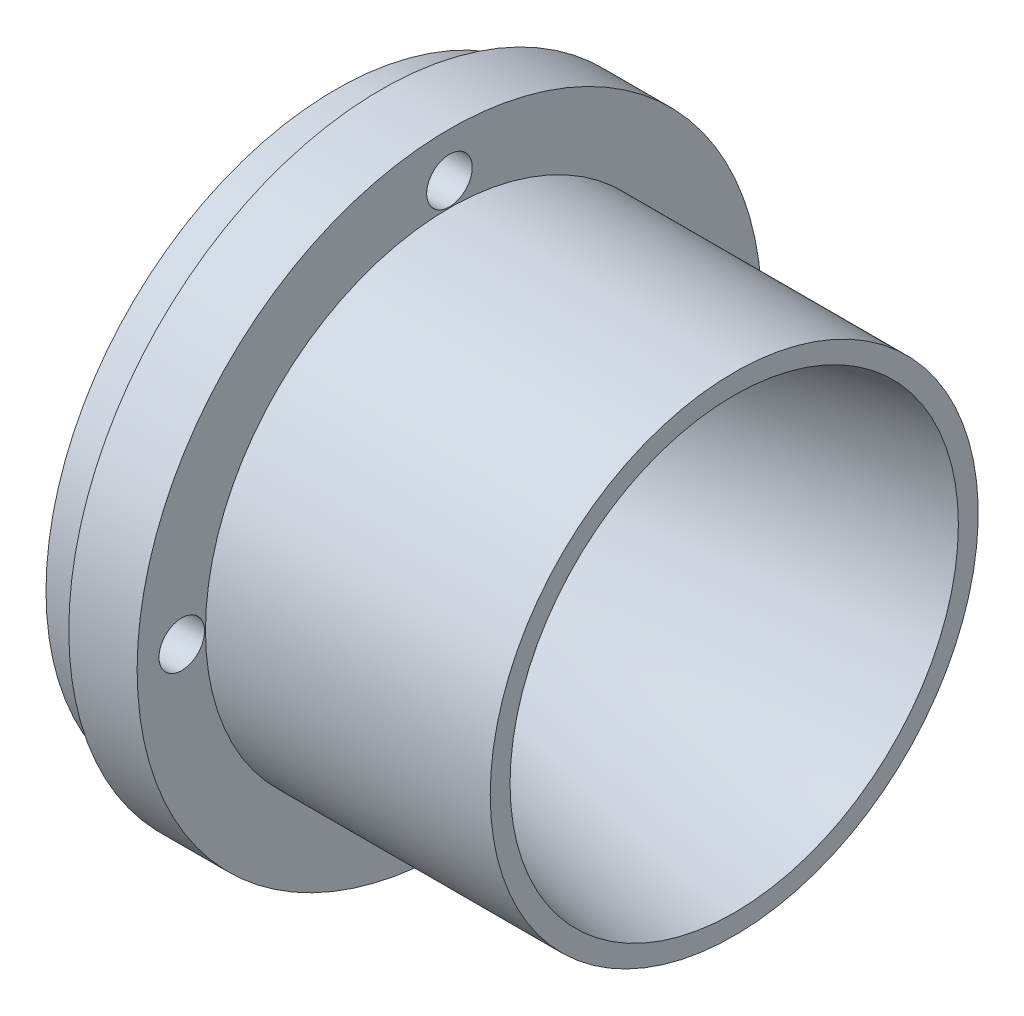
ISO-10303-21;
HEADER;
FILE_DESCRIPTION(('STEP AP214'),'2;1');
FILE_NAME('part.step','',(''),(''),'','','');
FILE_SCHEMA(('AUTOMOTIVE_DESIGN { 1 0 10303 214 1 1 1 1 }'));
ENDSEC;
DATA;
#1=APPLICATION_CONTEXT('core data for automotive mechanical design processes');
#2=APPLICATION_PROTOCOL_DEFINITION('international standard','automotive_design',2000,#1);
#3=PRODUCT_CONTEXT('',#1,'mechanical');
#4=PRODUCT('Part','Part','',(#3));
#5=PRODUCT_RELATED_PRODUCT_CATEGORY('part','',(#4));
#6=PRODUCT_DEFINITION_FORMATION('','',#4);
#7=PRODUCT_DEFINITION_CONTEXT('part definition',#1,'design');
#8=PRODUCT_DEFINITION('design','',#6,#7);
#9=PRODUCT_DEFINITION_SHAPE('','',#8);
#10=(LENGTH_UNIT() NAMED_UNIT(*) SI_UNIT(.MILLI.,.METRE.));
#11=(NAMED_UNIT(*) PLANE_ANGLE_UNIT() SI_UNIT($,.RADIAN.));
#12=(NAMED_UNIT(*) SI_UNIT($,.STERADIAN.) SOLID_ANGLE_UNIT());
#13=UNCERTAINTY_MEASURE_WITH_UNIT(LENGTH_MEASURE(1.E-05),#10,'distance_accuracy_value','');
#14=(GEOMETRIC_REPRESENTATION_CONTEXT(3) GLOBAL_UNCERTAINTY_ASSIGNED_CONTEXT((#13)) GLOBAL_UNIT_ASSIGNED_CONTEXT((#10,
#11,#12)) REPRESENTATION_CONTEXT('',''));
#15=CARTESIAN_POINT('',(0.,0.,0.));
#16=DIRECTION('',(0.,0.,1.));
#17=DIRECTION('',(1.,0.,0.));
#18=AXIS2_PLACEMENT_3D('',#15,#16,#17);
#19=CARTESIAN_POINT('',(57.15,0.,0.));
#20=DIRECTION('',(-1.,0.,0.));
#21=DIRECTION('',(0.,0.,1.));
#22=AXIS2_PLACEMENT_3D('',#19,#20,#21);
#23=PLANE('',#22);
#24=CARTESIAN_POINT('',(57.15,0.,0.));
#25=DIRECTION('',(-1.,0.,0.));
#26=DIRECTION('',(0.,0.,1.));
#27=AXIS2_PLACEMENT_3D('',#24,#25,#26);
#28=CIRCLE('',#27,22.8854);
#29=CARTESIAN_POINT('',(57.15,0.,22.8854));
#30=VERTEX_POINT('',#29);
#31=EDGE_CURVE('E112',#30,#30,#28,.T.);
#32=ORIENTED_EDGE('',*,*,#31,.T.);
#33=EDGE_LOOP('',(#32));
#34=FACE_BOUND('',#33,.T.);
#35=CARTESIAN_POINT('',(57.15,0.,0.));
#36=DIRECTION('',(-1.,0.,0.));
#37=DIRECTION('',(0.,0.,1.));
#38=AXIS2_PLACEMENT_3D('',#35,#36,#37);
#39=CIRCLE('',#38,12.7390881433566);
#40=CARTESIAN_POINT('',(57.15,0.,12.7390881433566));
#41=VERTEX_POINT('',#40);
#42=EDGE_CURVE('E39',#41,#41,#39,.T.);
#43=ORIENTED_EDGE('',*,*,#42,.F.);
#44=EDGE_LOOP('',(#43));
#45=FACE_BOUND('',#44,.T.);
#46=ADVANCED_FACE('F35',(#34,#45),#23,.T.);
#47=CARTESIAN_POINT('',(-88.99,0.,0.));
#48=DIRECTION('',(-1.,0.,0.));
#49=DIRECTION('',(0.,0.,1.));
#50=AXIS2_PLACEMENT_3D('',#47,#48,#49);
#51=CYLINDRICAL_SURFACE('',#50,34.8234);
#52=CARTESIAN_POINT('',(69.85,0.,0.));
#53=DIRECTION('',(-1.,0.,0.));
#54=DIRECTION('',(0.,0.,1.));
#55=AXIS2_PLACEMENT_3D('',#52,#53,#54);
#56=CIRCLE('',#55,34.8234);
#57=CARTESIAN_POINT('',(69.85,0.,34.8234));
#58=VERTEX_POINT('',#57);
#59=EDGE_CURVE('E43',#58,#58,#56,.T.);
#60=ORIENTED_EDGE('',*,*,#59,.T.);
#61=EDGE_LOOP('',(#60));
#62=FACE_BOUND('',#61,.T.);
#63=CARTESIAN_POINT('',(62.23,0.,0.));
#64=DIRECTION('',(-1.,0.,0.));
#65=DIRECTION('',(0.,0.,1.));
#66=AXIS2_PLACEMENT_3D('',#63,#64,#65);
#67=CIRCLE('',#66,34.8234);
#68=CARTESIAN_POINT('',(62.23,0.,34.8234));
#69=VERTEX_POINT('',#68);
#70=EDGE_CURVE('E61',#69,#69,#67,.T.);
#71=ORIENTED_EDGE('',*,*,#70,.F.);
#72=EDGE_LOOP('',(#71));
#73=FACE_BOUND('',#72,.T.);
#74=ADVANCED_FACE('F155',(#62,#73),#51,.T.);
#75=CARTESIAN_POINT('',(131.36778252185,0.,0.));
#76=DIRECTION('',(-1.,0.,0.));
#77=DIRECTION('',(0.,0.,1.));
#78=AXIS2_PLACEMENT_3D('',#75,#76,#77);
#79=DEGENERATE_TOROIDAL_SURFACE('',#78,169.723720561331,196.979582197912,.F.);
#80=CARTESIAN_POINT('',(101.599999999996,0.,0.));
#81=DIRECTION('',(-1.,0.,0.));
#82=DIRECTION('',(0.,0.,1.));
#83=AXIS2_PLACEMENT_3D('',#80,#81,#82);
#84=CIRCLE('',#83,24.9936000000294);
#85=CARTESIAN_POINT('',(101.599999999996,0.,24.9936000000294));
#86=VERTEX_POINT('',#85);
#87=EDGE_CURVE('E10',#86,#86,#84,.T.);
#88=ORIENTED_EDGE('',*,*,#87,.F.);
#89=EDGE_LOOP('',(#88));
#90=FACE_BOUND('',#89,.T.);
#91=ORIENTED_EDGE('',*,*,#42,.T.);
#92=EDGE_LOOP('',(#91));
#93=FACE_BOUND('',#92,.T.);
#94=ADVANCED_FACE('F160',(#90,#93),#79,.T.);
#95=CARTESIAN_POINT('',(101.6,34.8234,0.));
#96=DIRECTION('',(-1.,0.,0.));
#97=DIRECTION('',(0.,0.,1.));
#98=AXIS2_PLACEMENT_3D('',#95,#96,#97);
#99=PLANE('',#98);
#100=ORIENTED_EDGE('',*,*,#87,.T.);
#101=EDGE_LOOP('',(#100));
#102=FACE_BOUND('',#101,.T.);
#103=CARTESIAN_POINT('',(101.6,0.,0.));
#104=DIRECTION('',(-1.,0.,0.));
#105=DIRECTION('',(0.,0.,1.));
#106=AXIS2_PLACEMENT_3D('',#103,#104,#105);
#107=CIRCLE('',#106,27.2034);
#108=CARTESIAN_POINT('',(101.6,0.,27.2034));
#109=VERTEX_POINT('',#108);
#110=EDGE_CURVE('E52',#109,#109,#107,.T.);
#111=ORIENTED_EDGE('',*,*,#110,.F.);
#112=EDGE_LOOP('',(#111));
#113=FACE_BOUND('',#112,.T.);
#114=ADVANCED_FACE('F37',(#102,#113),#99,.F.);
#115=CARTESIAN_POINT('',(69.85,27.2034,0.));
#116=DIRECTION('',(1.,0.,0.));
#117=DIRECTION('',(0.,0.,-1.));
#118=AXIS2_PLACEMENT_3D('',#115,#116,#117);
#119=PLANE('',#118);
#120=CARTESIAN_POINT('',(69.85,3.1260978167332E-13,-29.845));
#121=DIRECTION('',(1.,0.,0.));
#122=DIRECTION('',(0.,0.,-1.));
#123=AXIS2_PLACEMENT_3D('',#120,#121,#122);
#124=CIRCLE('',#123,2.54);
#125=CARTESIAN_POINT('',(69.85,3.1260978167332E-13,-32.385));
#126=VERTEX_POINT('',#125);
#127=EDGE_CURVE('E109',#126,#126,#124,.T.);
#128=ORIENTED_EDGE('',*,*,#127,.F.);
#129=EDGE_LOOP('',(#128));
#130=FACE_BOUND('',#129,.T.);
#131=CARTESIAN_POINT('',(69.85,-29.845,0.));
#132=DIRECTION('',(1.,0.,0.));
#133=DIRECTION('',(0.,0.,-1.));
#134=AXIS2_PLACEMENT_3D('',#131,#132,#133);
#135=CIRCLE('',#134,2.54);
#136=CARTESIAN_POINT('',(69.85,-29.845,-2.54));
#137=VERTEX_POINT('',#136);
#138=EDGE_CURVE('E97',#137,#137,#135,.T.);
#139=ORIENTED_EDGE('',*,*,#138,.F.);
#140=EDGE_LOOP('',(#139));
#141=FACE_BOUND('',#140,.T.);
#142=CARTESIAN_POINT('',(69.85,-1.04203260557773E-13,29.845));
#143=DIRECTION('',(1.,0.,0.));
#144=DIRECTION('',(0.,0.,-1.));
#145=AXIS2_PLACEMENT_3D('',#142,#143,#144);
#146=CIRCLE('',#145,2.54);
#147=CARTESIAN_POINT('',(69.85,-1.04203260557773E-13,27.305));
#148=VERTEX_POINT('',#147);
#149=EDGE_CURVE('E85',#148,#148,#146,.T.);
#150=ORIENTED_EDGE('',*,*,#149,.F.);
#151=EDGE_LOOP('',(#150));
#152=FACE_BOUND('',#151,.T.);
#153=CARTESIAN_POINT('',(69.85,29.845,0.));
#154=DIRECTION('',(1.,0.,0.));
#155=DIRECTION('',(0.,0.,-1.));
#156=AXIS2_PLACEMENT_3D('',#153,#154,#155);
#157=CIRCLE('',#156,2.54);
#158=CARTESIAN_POINT('',(69.85,29.845,-2.54));
#159=VERTEX_POINT('',#158);
#160=EDGE_CURVE('E73',#159,#159,#157,.T.);
#161=ORIENTED_EDGE('',*,*,#160,.F.);
#162=EDGE_LOOP('',(#161));
#163=FACE_BOUND('',#162,.T.);
#164=CARTESIAN_POINT('',(69.85,0.,0.));
#165=DIRECTION('',(-1.,0.,0.));
#166=DIRECTION('',(0.,0.,1.));
#167=AXIS2_PLACEMENT_3D('',#164,#165,#166);
#168=CIRCLE('',#167,27.2034);
#169=CARTESIAN_POINT('',(69.85,0.,27.2034));
#170=VERTEX_POINT('',#169);
#171=EDGE_CURVE('E47',#170,#170,#168,.T.);
#172=ORIENTED_EDGE('',*,*,#171,.T.);
#173=EDGE_LOOP('',(#172));
#174=FACE_BOUND('',#173,.T.);
#175=ORIENTED_EDGE('',*,*,#59,.F.);
#176=EDGE_LOOP('',(#175));
#177=FACE_BOUND('',#176,.T.);
#178=ADVANCED_FACE('F166',(#130,#141,#152,#163,#174,#177),#119,.T.);
#179=CARTESIAN_POINT('',(-14.4069937020437,0.,0.));
#180=DIRECTION('',(-1.,0.,0.));
#181=DIRECTION('',(0.,0.,1.));
#182=AXIS2_PLACEMENT_3D('',#179,#180,#181);
#183=CYLINDRICAL_SURFACE('',#182,27.2034);
#184=ORIENTED_EDGE('',*,*,#110,.T.);
#185=EDGE_LOOP('',(#184));
#186=FACE_BOUND('',#185,.T.);
#187=ORIENTED_EDGE('',*,*,#171,.F.);
#188=EDGE_LOOP('',(#187));
#189=FACE_BOUND('',#188,.T.);
#190=ADVANCED_FACE('F132',(#186,#189),#183,.T.);
#191=CARTESIAN_POINT('',(57.15,0.,0.));
#192=DIRECTION('',(-1.,0.,0.));
#193=DIRECTION('',(0.,0.,1.));
#194=AXIS2_PLACEMENT_3D('',#191,#192,#193);
#195=CIRCLE('',#194,25.9842);
#196=CARTESIAN_POINT('',(57.15,0.,25.9842));
#197=VERTEX_POINT('',#196);
#198=EDGE_CURVE('E121',#197,#197,#195,.T.);
#199=ORIENTED_EDGE('',*,*,#198,.F.);
#200=EDGE_LOOP('',(#199));
#201=FACE_BOUND('',#200,.T.);
#202=CARTESIAN_POINT('',(57.15,3.1260978167332E-13,-29.845));
#203=DIRECTION('',(1.,0.,0.));
#204=DIRECTION('',(0.,0.,-1.));
#205=AXIS2_PLACEMENT_3D('',#202,#203,#204);
#206=CIRCLE('',#205,1.63195000000001);
#207=CARTESIAN_POINT('',(57.15,3.1260978167332E-13,-31.47695));
#208=VERTEX_POINT('',#207);
#209=EDGE_CURVE('E100',#208,#208,#206,.T.);
#210=ORIENTED_EDGE('',*,*,#209,.T.);
#211=EDGE_LOOP('',(#210));
#212=FACE_BOUND('',#211,.T.);
#213=CARTESIAN_POINT('',(57.15,-29.845,0.));
#214=DIRECTION('',(1.,0.,0.));
#215=DIRECTION('',(0.,0.,-1.));
#216=AXIS2_PLACEMENT_3D('',#213,#214,#215);
#217=CIRCLE('',#216,1.63195000000001);
#218=CARTESIAN_POINT('',(57.15,-29.845,-1.63195000000001));
#219=VERTEX_POINT('',#218);
#220=EDGE_CURVE('E88',#219,#219,#217,.T.);
#221=ORIENTED_EDGE('',*,*,#220,.T.);
#222=EDGE_LOOP('',(#221));
#223=FACE_BOUND('',#222,.T.);
#224=CARTESIAN_POINT('',(57.15,-1.04203260557773E-13,29.845));
#225=DIRECTION('',(1.,0.,0.));
#226=DIRECTION('',(0.,0.,-1.));
#227=AXIS2_PLACEMENT_3D('',#224,#225,#226);
#228=CIRCLE('',#227,1.63195000000001);
#229=CARTESIAN_POINT('',(57.15,-1.04203260557773E-13,28.21305));
#230=VERTEX_POINT('',#229);
#231=EDGE_CURVE('E76',#230,#230,#228,.T.);
#232=ORIENTED_EDGE('',*,*,#231,.T.);
#233=EDGE_LOOP('',(#232));
#234=FACE_BOUND('',#233,.T.);
#235=CARTESIAN_POINT('',(57.15,29.845,0.));
#236=DIRECTION('',(1.,0.,0.));
#237=DIRECTION('',(0.,0.,-1.));
#238=AXIS2_PLACEMENT_3D('',#235,#236,#237);
#239=CIRCLE('',#238,1.63195000000001);
#240=CARTESIAN_POINT('',(57.15,29.845,-1.63195000000001));
#241=VERTEX_POINT('',#240);
#242=EDGE_CURVE('E64',#241,#241,#239,.T.);
#243=ORIENTED_EDGE('',*,*,#242,.T.);
#244=EDGE_LOOP('',(#243));
#245=FACE_BOUND('',#244,.T.);
#246=CARTESIAN_POINT('',(57.15,0.,0.));
#247=DIRECTION('',(-1.,0.,0.));
#248=DIRECTION('',(0.,0.,1.));
#249=AXIS2_PLACEMENT_3D('',#246,#247,#248);
#250=CIRCLE('',#249,32.2834);
#251=CARTESIAN_POINT('',(57.15,0.,32.2834));
#252=VERTEX_POINT('',#251);
#253=EDGE_CURVE('E55',#252,#252,#250,.T.);
#254=ORIENTED_EDGE('',*,*,#253,.T.);
#255=EDGE_LOOP('',(#254));
#256=FACE_BOUND('',#255,.T.);
#257=ADVANCED_FACE('F128',(#201,#212,#223,#234,#245,#256),#23,.T.);
#258=CARTESIAN_POINT('',(-14.4069937020437,0.,0.));
#259=DIRECTION('',(-1.,0.,0.));
#260=DIRECTION('',(0.,0.,1.));
#261=AXIS2_PLACEMENT_3D('',#258,#259,#260);
#262=CYLINDRICAL_SURFACE('',#261,32.2834);
#263=CARTESIAN_POINT('',(62.23,0.,0.));
#264=DIRECTION('',(-1.,0.,0.));
#265=DIRECTION('',(0.,0.,1.));
#266=AXIS2_PLACEMENT_3D('',#263,#264,#265);
#267=CIRCLE('',#266,32.2834);
#268=CARTESIAN_POINT('',(62.23,0.,32.2834));
#269=VERTEX_POINT('',#268);
#270=EDGE_CURVE('E58',#269,#269,#267,.T.);
#271=ORIENTED_EDGE('',*,*,#270,.T.);
#272=EDGE_LOOP('',(#271));
#273=FACE_BOUND('',#272,.T.);
#274=ORIENTED_EDGE('',*,*,#253,.F.);
#275=EDGE_LOOP('',(#274));
#276=FACE_BOUND('',#275,.T.);
#277=ADVANCED_FACE('F131',(#273,#276),#262,.T.);
#278=CARTESIAN_POINT('',(62.23,32.2834,0.));
#279=DIRECTION('',(-1.,0.,0.));
#280=DIRECTION('',(0.,0.,1.));
#281=AXIS2_PLACEMENT_3D('',#278,#279,#280);
#282=PLANE('',#281);
#283=ORIENTED_EDGE('',*,*,#70,.T.);
#284=EDGE_LOOP('',(#283));
#285=FACE_BOUND('',#284,.T.);
#286=ORIENTED_EDGE('',*,*,#270,.F.);
#287=EDGE_LOOP('',(#286));
#288=FACE_BOUND('',#287,.T.);
#289=ADVANCED_FACE('F145',(#285,#288),#282,.T.);
#290=CARTESIAN_POINT('',(69.85,29.845,0.));
#291=DIRECTION('',(1.,0.,0.));
#292=DIRECTION('',(0.,0.,-1.));
#293=AXIS2_PLACEMENT_3D('',#290,#291,#292);
#294=CYLINDRICAL_SURFACE('',#293,1.63195000000001);
#295=ORIENTED_EDGE('',*,*,#242,.F.);
#296=EDGE_LOOP('',(#295));
#297=FACE_BOUND('',#296,.T.);
#298=CARTESIAN_POINT('',(65.786,29.845,0.));
#299=DIRECTION('',(1.,0.,0.));
#300=DIRECTION('',(0.,0.,-1.));
#301=AXIS2_PLACEMENT_3D('',#298,#299,#300);
#302=CIRCLE('',#301,1.63195);
#303=CARTESIAN_POINT('',(65.786,29.845,-1.63195));
#304=VERTEX_POINT('',#303);
#305=EDGE_CURVE('E67',#304,#304,#302,.T.);
#306=ORIENTED_EDGE('',*,*,#305,.T.);
#307=EDGE_LOOP('',(#306));
#308=FACE_BOUND('',#307,.T.);
#309=ADVANCED_FACE('F151',(#297,#308),#294,.F.);
#310=CARTESIAN_POINT('',(65.786,31.47695,0.));
#311=DIRECTION('',(-1.,0.,0.));
#312=DIRECTION('',(0.,0.,1.));
#313=AXIS2_PLACEMENT_3D('',#310,#311,#312);
#314=PLANE('',#313);
#315=ORIENTED_EDGE('',*,*,#305,.F.);
#316=EDGE_LOOP('',(#315));
#317=FACE_BOUND('',#316,.T.);
#318=CARTESIAN_POINT('',(65.786,29.845,0.));
#319=DIRECTION('',(1.,0.,0.));
#320=DIRECTION('',(0.,0.,-1.));
#321=AXIS2_PLACEMENT_3D('',#318,#319,#320);
#322=CIRCLE('',#321,2.54);
#323=CARTESIAN_POINT('',(65.786,29.845,-2.54));
#324=VERTEX_POINT('',#323);
#325=EDGE_CURVE('E70',#324,#324,#322,.T.);
#326=ORIENTED_EDGE('',*,*,#325,.T.);
#327=EDGE_LOOP('',(#326));
#328=FACE_BOUND('',#327,.T.);
#329=ADVANCED_FACE('F284',(#317,#328),#314,.F.);
#330=CARTESIAN_POINT('',(69.85,29.845,0.));
#331=DIRECTION('',(1.,0.,0.));
#332=DIRECTION('',(0.,0.,-1.));
#333=AXIS2_PLACEMENT_3D('',#330,#331,#332);
#334=CYLINDRICAL_SURFACE('',#333,2.54);
#335=ORIENTED_EDGE('',*,*,#325,.F.);
#336=EDGE_LOOP('',(#335));
#337=FACE_BOUND('',#336,.T.);
#338=ORIENTED_EDGE('',*,*,#160,.T.);
#339=EDGE_LOOP('',(#338));
#340=FACE_BOUND('',#339,.T.);
#341=ADVANCED_FACE('F280',(#337,#340),#334,.F.);
#342=CARTESIAN_POINT('',(69.85,-1.04203260557773E-13,29.845));
#343=DIRECTION('',(1.,0.,0.));
#344=DIRECTION('',(0.,0.,-1.));
#345=AXIS2_PLACEMENT_3D('',#342,#343,#344);
#346=CYLINDRICAL_SURFACE('',#345,1.63195);
#347=ORIENTED_EDGE('',*,*,#231,.F.);
#348=EDGE_LOOP('',(#347));
#349=FACE_BOUND('',#348,.T.);
#350=CARTESIAN_POINT('',(65.786,-1.04203260557773E-13,29.845));
#351=DIRECTION('',(1.,0.,0.));
#352=DIRECTION('',(0.,0.,-1.));
#353=AXIS2_PLACEMENT_3D('',#350,#351,#352);
#354=CIRCLE('',#353,1.63195);
#355=CARTESIAN_POINT('',(65.786,-1.04203260557773E-13,28.21305));
#356=VERTEX_POINT('',#355);
#357=EDGE_CURVE('E79',#356,#356,#354,.T.);
#358=ORIENTED_EDGE('',*,*,#357,.T.);
#359=EDGE_LOOP('',(#358));
#360=FACE_BOUND('',#359,.T.);
#361=ADVANCED_FACE('F276',(#349,#360),#346,.F.);
#362=CARTESIAN_POINT('',(65.786,1.6319499999999,29.845));
#363=DIRECTION('',(-1.,0.,0.));
#364=DIRECTION('',(0.,0.,1.));
#365=AXIS2_PLACEMENT_3D('',#362,#363,#364);
#366=PLANE('',#365);
#367=ORIENTED_EDGE('',*,*,#357,.F.);
#368=EDGE_LOOP('',(#367));
#369=FACE_BOUND('',#368,.T.);
#370=CARTESIAN_POINT('',(65.786,-1.04203260557773E-13,29.845));
#371=DIRECTION('',(1.,0.,0.));
#372=DIRECTION('',(0.,0.,-1.));
#373=AXIS2_PLACEMENT_3D('',#370,#371,#372);
#374=CIRCLE('',#373,2.54);
#375=CARTESIAN_POINT('',(65.786,-1.04203260557773E-13,27.305));
#376=VERTEX_POINT('',#375);
#377=EDGE_CURVE('E82',#376,#376,#374,.T.);
#378=ORIENTED_EDGE('',*,*,#377,.T.);
#379=EDGE_LOOP('',(#378));
#380=FACE_BOUND('',#379,.T.);
#381=ADVANCED_FACE('F272',(#369,#380),#366,.F.);
#382=CARTESIAN_POINT('',(69.85,-1.04203260557773E-13,29.845));
#383=DIRECTION('',(1.,0.,0.));
#384=DIRECTION('',(0.,0.,-1.));
#385=AXIS2_PLACEMENT_3D('',#382,#383,#384);
#386=CYLINDRICAL_SURFACE('',#385,2.54);
#387=ORIENTED_EDGE('',*,*,#377,.F.);
#388=EDGE_LOOP('',(#387));
#389=FACE_BOUND('',#388,.T.);
#390=ORIENTED_EDGE('',*,*,#149,.T.);
#391=EDGE_LOOP('',(#390));
#392=FACE_BOUND('',#391,.T.);
#393=ADVANCED_FACE('F268',(#389,#392),#386,.F.);
#394=CARTESIAN_POINT('',(69.85,-29.845,0.));
#395=DIRECTION('',(1.,0.,0.));
#396=DIRECTION('',(0.,0.,-1.));
#397=AXIS2_PLACEMENT_3D('',#394,#395,#396);
#398=CYLINDRICAL_SURFACE('',#397,1.63195);
#399=ORIENTED_EDGE('',*,*,#220,.F.);
#400=EDGE_LOOP('',(#399));
#401=FACE_BOUND('',#400,.T.);
#402=CARTESIAN_POINT('',(65.786,-29.845,0.));
#403=DIRECTION('',(1.,0.,0.));
#404=DIRECTION('',(0.,0.,-1.));
#405=AXIS2_PLACEMENT_3D('',#402,#403,#404);
#406=CIRCLE('',#405,1.63195);
#407=CARTESIAN_POINT('',(65.786,-29.845,-1.63195));
#408=VERTEX_POINT('',#407);
#409=EDGE_CURVE('E91',#408,#408,#406,.T.);
#410=ORIENTED_EDGE('',*,*,#409,.T.);
#411=EDGE_LOOP('',(#410));
#412=FACE_BOUND('',#411,.T.);
#413=ADVANCED_FACE('F264',(#401,#412),#398,.F.);
#414=CARTESIAN_POINT('',(65.786,-28.21305,0.));
#415=DIRECTION('',(-1.,0.,0.));
#416=DIRECTION('',(0.,0.,1.));
#417=AXIS2_PLACEMENT_3D('',#414,#415,#416);
#418=PLANE('',#417);
#419=ORIENTED_EDGE('',*,*,#409,.F.);
#420=EDGE_LOOP('',(#419));
#421=FACE_BOUND('',#420,.T.);
#422=CARTESIAN_POINT('',(65.786,-29.845,0.));
#423=DIRECTION('',(1.,0.,0.));
#424=DIRECTION('',(0.,0.,-1.));
#425=AXIS2_PLACEMENT_3D('',#422,#423,#424);
#426=CIRCLE('',#425,2.54);
#427=CARTESIAN_POINT('',(65.786,-29.845,-2.54));
#428=VERTEX_POINT('',#427);
#429=EDGE_CURVE('E94',#428,#428,#426,.T.);
#430=ORIENTED_EDGE('',*,*,#429,.T.);
#431=EDGE_LOOP('',(#430));
#432=FACE_BOUND('',#431,.T.);
#433=ADVANCED_FACE('F260',(#421,#432),#418,.F.);
#434=CARTESIAN_POINT('',(69.85,-29.845,0.));
#435=DIRECTION('',(1.,0.,0.));
#436=DIRECTION('',(0.,0.,-1.));
#437=AXIS2_PLACEMENT_3D('',#434,#435,#436);
#438=CYLINDRICAL_SURFACE('',#437,2.54);
#439=ORIENTED_EDGE('',*,*,#429,.F.);
#440=EDGE_LOOP('',(#439));
#441=FACE_BOUND('',#440,.T.);
#442=ORIENTED_EDGE('',*,*,#138,.T.);
#443=EDGE_LOOP('',(#442));
#444=FACE_BOUND('',#443,.T.);
#445=ADVANCED_FACE('F256',(#441,#444),#438,.F.);
#446=CARTESIAN_POINT('',(69.85,3.1260978167332E-13,-29.845));
#447=DIRECTION('',(1.,0.,0.));
#448=DIRECTION('',(0.,0.,-1.));
#449=AXIS2_PLACEMENT_3D('',#446,#447,#448);
#450=CYLINDRICAL_SURFACE('',#449,1.63195);
#451=ORIENTED_EDGE('',*,*,#209,.F.);
#452=EDGE_LOOP('',(#451));
#453=FACE_BOUND('',#452,.T.);
#454=CARTESIAN_POINT('',(65.786,3.1260978167332E-13,-29.845));
#455=DIRECTION('',(1.,0.,0.));
#456=DIRECTION('',(0.,0.,-1.));
#457=AXIS2_PLACEMENT_3D('',#454,#455,#456);
#458=CIRCLE('',#457,1.63195);
#459=CARTESIAN_POINT('',(65.786,3.1260978167332E-13,-31.47695));
#460=VERTEX_POINT('',#459);
#461=EDGE_CURVE('E103',#460,#460,#458,.T.);
#462=ORIENTED_EDGE('',*,*,#461,.T.);
#463=EDGE_LOOP('',(#462));
#464=FACE_BOUND('',#463,.T.);
#465=ADVANCED_FACE('F252',(#453,#464),#450,.F.);
#466=CARTESIAN_POINT('',(65.786,1.63195000000031,-29.845));
#467=DIRECTION('',(-1.,0.,0.));
#468=DIRECTION('',(0.,0.,1.));
#469=AXIS2_PLACEMENT_3D('',#466,#467,#468);
#470=PLANE('',#469);
#471=ORIENTED_EDGE('',*,*,#461,.F.);
#472=EDGE_LOOP('',(#471));
#473=FACE_BOUND('',#472,.T.);
#474=CARTESIAN_POINT('',(65.786,3.1260978167332E-13,-29.845));
#475=DIRECTION('',(1.,0.,0.));
#476=DIRECTION('',(0.,0.,-1.));
#477=AXIS2_PLACEMENT_3D('',#474,#475,#476);
#478=CIRCLE('',#477,2.54);
#479=CARTESIAN_POINT('',(65.786,3.1260978167332E-13,-32.385));
#480=VERTEX_POINT('',#479);
#481=EDGE_CURVE('E106',#480,#480,#478,.T.);
#482=ORIENTED_EDGE('',*,*,#481,.T.);
#483=EDGE_LOOP('',(#482));
#484=FACE_BOUND('',#483,.T.);
#485=ADVANCED_FACE('F248',(#473,#484),#470,.F.);
#486=CARTESIAN_POINT('',(69.85,3.1260978167332E-13,-29.845));
#487=DIRECTION('',(1.,0.,0.));
#488=DIRECTION('',(0.,0.,-1.));
#489=AXIS2_PLACEMENT_3D('',#486,#487,#488);
#490=CYLINDRICAL_SURFACE('',#489,2.54);
#491=ORIENTED_EDGE('',*,*,#481,.F.);
#492=EDGE_LOOP('',(#491));
#493=FACE_BOUND('',#492,.T.);
#494=ORIENTED_EDGE('',*,*,#127,.T.);
#495=EDGE_LOOP('',(#494));
#496=FACE_BOUND('',#495,.T.);
#497=ADVANCED_FACE('F223',(#493,#496),#490,.F.);
#498=CARTESIAN_POINT('',(-14.4069937020437,0.,0.));
#499=DIRECTION('',(-1.,0.,0.));
#500=DIRECTION('',(0.,0.,1.));
#501=AXIS2_PLACEMENT_3D('',#498,#499,#500);
#502=CYLINDRICAL_SURFACE('',#501,22.8854);
#503=CARTESIAN_POINT('',(59.0804,0.,0.));
#504=DIRECTION('',(-1.,0.,0.));
#505=DIRECTION('',(0.,0.,1.));
#506=AXIS2_PLACEMENT_3D('',#503,#504,#505);
#507=CIRCLE('',#506,22.8854);
#508=CARTESIAN_POINT('',(59.0804,0.,22.8854));
#509=VERTEX_POINT('',#508);
#510=EDGE_CURVE('E115',#509,#509,#507,.T.);
#511=ORIENTED_EDGE('',*,*,#510,.T.);
#512=EDGE_LOOP('',(#511));
#513=FACE_BOUND('',#512,.T.);
#514=ORIENTED_EDGE('',*,*,#31,.F.);
#515=EDGE_LOOP('',(#514));
#516=FACE_BOUND('',#515,.T.);
#517=ADVANCED_FACE('F217',(#513,#516),#502,.T.);
#518=CARTESIAN_POINT('',(59.0804,25.9842,0.));
#519=DIRECTION('',(-1.,0.,0.));
#520=DIRECTION('',(0.,0.,1.));
#521=AXIS2_PLACEMENT_3D('',#518,#519,#520);
#522=PLANE('',#521);
#523=CARTESIAN_POINT('',(59.0804,0.,0.));
#524=DIRECTION('',(-1.,0.,0.));
#525=DIRECTION('',(0.,0.,1.));
#526=AXIS2_PLACEMENT_3D('',#523,#524,#525);
#527=CIRCLE('',#526,25.9842);
#528=CARTESIAN_POINT('',(59.0804,0.,25.9842));
#529=VERTEX_POINT('',#528);
#530=EDGE_CURVE('E118',#529,#529,#527,.T.);
#531=ORIENTED_EDGE('',*,*,#530,.T.);
#532=EDGE_LOOP('',(#531));
#533=FACE_BOUND('',#532,.T.);
#534=ORIENTED_EDGE('',*,*,#510,.F.);
#535=EDGE_LOOP('',(#534));
#536=FACE_BOUND('',#535,.T.);
#537=ADVANCED_FACE('F222',(#533,#536),#522,.T.);
#538=CARTESIAN_POINT('',(-14.4069937020437,0.,0.));
#539=DIRECTION('',(-1.,0.,0.));
#540=DIRECTION('',(0.,0.,1.));
#541=AXIS2_PLACEMENT_3D('',#538,#539,#540);
#542=CYLINDRICAL_SURFACE('',#541,25.9842);
#543=ORIENTED_EDGE('',*,*,#198,.T.);
#544=EDGE_LOOP('',(#543));
#545=FACE_BOUND('',#544,.T.);
#546=ORIENTED_EDGE('',*,*,#530,.F.);
#547=EDGE_LOOP('',(#546));
#548=FACE_BOUND('',#547,.T.);
#549=ADVANCED_FACE('F125',(#545,#548),#542,.F.);
#550=CLOSED_SHELL('',(#46,#74,#94,#114,#178,#190,#257,#277,#289,#309,#329,#341,#361,#381,#393,
#413,#433,#445,#465,#485,#497,#517,#537,#549));
#551=MANIFOLD_SOLID_BREP('B2',#550);
#552=ADVANCED_BREP_SHAPE_REPRESENTATION('',(#18,#551),#14);
#553=SHAPE_DEFINITION_REPRESENTATION(#9,#552);
ENDSEC;
END-ISO-10303-21;
